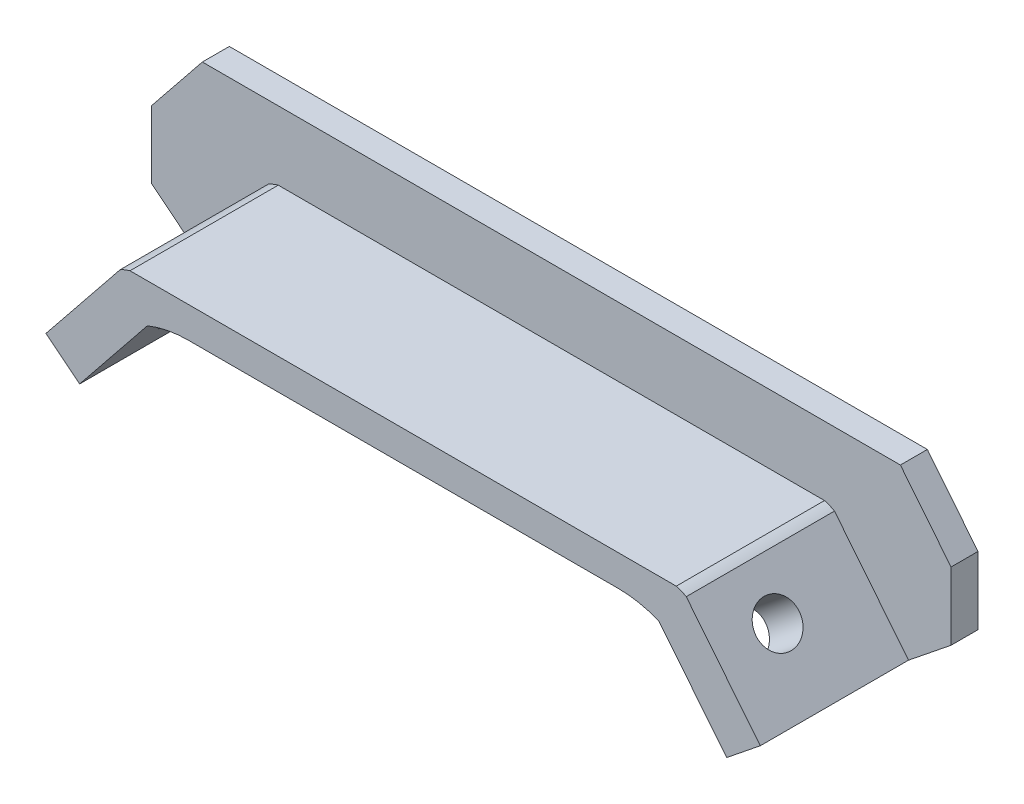
ISO-10303-21;
HEADER;
FILE_DESCRIPTION(('STEP AP214'),'2;1');
FILE_NAME('part.step','',(''),(''),'','','');
FILE_SCHEMA(('AUTOMOTIVE_DESIGN { 1 0 10303 214 1 1 1 1 }'));
ENDSEC;
DATA;
#1=APPLICATION_CONTEXT('core data for automotive mechanical design processes');
#2=APPLICATION_PROTOCOL_DEFINITION('international standard','automotive_design',2000,#1);
#3=PRODUCT_CONTEXT('',#1,'mechanical');
#4=PRODUCT('Part','Part','',(#3));
#5=PRODUCT_RELATED_PRODUCT_CATEGORY('part','',(#4));
#6=PRODUCT_DEFINITION_FORMATION('','',#4);
#7=PRODUCT_DEFINITION_CONTEXT('part definition',#1,'design');
#8=PRODUCT_DEFINITION('design','',#6,#7);
#9=PRODUCT_DEFINITION_SHAPE('','',#8);
#10=(LENGTH_UNIT() NAMED_UNIT(*) SI_UNIT(.MILLI.,.METRE.));
#11=(NAMED_UNIT(*) PLANE_ANGLE_UNIT() SI_UNIT($,.RADIAN.));
#12=(NAMED_UNIT(*) SI_UNIT($,.STERADIAN.) SOLID_ANGLE_UNIT());
#13=UNCERTAINTY_MEASURE_WITH_UNIT(LENGTH_MEASURE(1.E-05),#10,'distance_accuracy_value','');
#14=(GEOMETRIC_REPRESENTATION_CONTEXT(3) GLOBAL_UNCERTAINTY_ASSIGNED_CONTEXT((#13)) GLOBAL_UNIT_ASSIGNED_CONTEXT((#10,
#11,#12)) REPRESENTATION_CONTEXT('',''));
#15=CARTESIAN_POINT('',(0.,0.,0.));
#16=DIRECTION('',(0.,0.,1.));
#17=DIRECTION('',(1.,0.,0.));
#18=AXIS2_PLACEMENT_3D('',#15,#16,#17);
#19=CARTESIAN_POINT('',(-15.9530884003577,81.9,13.));
#20=DIRECTION('',(0.,0.,1.));
#21=DIRECTION('',(1.,0.,0.));
#22=AXIS2_PLACEMENT_3D('',#19,#20,#21);
#23=PLANE('',#22);
#24=DIRECTION('',(-0.779447316057059,-0.626467781686694,0.));
#25=VECTOR('',#24,1.);
#26=CARTESIAN_POINT('',(-32.1090383839074,39.9498657730275,13.));
#27=LINE('',#26,#25);
#28=CARTESIAN_POINT('',(26.5016886946061,87.05726022999,13.));
#29=VERTEX_POINT('',#28);
#30=CARTESIAN_POINT('',(24.0074572832235,85.0525633285926,13.));
#31=VERTEX_POINT('',#30);
#32=EDGE_CURVE('E469',#29,#31,#27,.T.);
#33=ORIENTED_EDGE('',*,*,#32,.F.);
#34=DIRECTION('',(-0.626467781686697,0.779447316057057,0.));
#35=VECTOR('',#34,1.);
#36=CARTESIAN_POINT('',(58.6107270785135,47.1073944569628,13.));
#37=LINE('',#36,#35);
#38=CARTESIAN_POINT('',(21.0070944191725,93.8936002398119,13.));
#39=VERTEX_POINT('',#38);
#40=EDGE_CURVE('E284',#29,#39,#37,.T.);
#41=ORIENTED_EDGE('',*,*,#40,.T.);
#42=CARTESIAN_POINT('',(19.4993683843613,91.3,13.));
#43=DIRECTION('',(0.,0.,1.));
#44=DIRECTION('',(1.,0.,0.));
#45=AXIS2_PLACEMENT_3D('',#42,#43,#44);
#46=CIRCLE('',#45,3.);
#47=CARTESIAN_POINT('',(20.2674829591482,94.2,13.));
#48=VERTEX_POINT('',#47);
#49=EDGE_CURVE('E462',#39,#48,#46,.T.);
#50=ORIENTED_EDGE('',*,*,#49,.T.);
#51=DIRECTION('',(1.,0.,0.));
#52=VECTOR('',#51,1.);
#53=CARTESIAN_POINT('',(0.,94.2,13.));
#54=LINE('',#53,#52);
#55=CARTESIAN_POINT('',(-20.2674829591482,94.2,13.));
#56=VERTEX_POINT('',#55);
#57=EDGE_CURVE('E271',#56,#48,#54,.T.);
#58=ORIENTED_EDGE('',*,*,#57,.F.);
#59=CARTESIAN_POINT('',(-19.4993683843613,91.3,13.));
#60=DIRECTION('',(0.,0.,1.));
#61=DIRECTION('',(1.,0.,0.));
#62=AXIS2_PLACEMENT_3D('',#59,#60,#61);
#63=CIRCLE('',#62,3.);
#64=CARTESIAN_POINT('',(-21.0070944191725,93.8936002398119,13.));
#65=VERTEX_POINT('',#64);
#66=EDGE_CURVE('E454',#56,#65,#63,.T.);
#67=ORIENTED_EDGE('',*,*,#66,.T.);
#68=DIRECTION('',(0.626467781686695,0.779447316057058,0.));
#69=VECTOR('',#68,1.);
#70=CARTESIAN_POINT('',(-58.6107270785135,47.1073944569625,13.));
#71=LINE('',#70,#69);
#72=CARTESIAN_POINT('',(-26.5016886946061,87.05726022999,13.));
#73=VERTEX_POINT('',#72);
#74=EDGE_CURVE('E297',#73,#65,#71,.T.);
#75=ORIENTED_EDGE('',*,*,#74,.F.);
#76=DIRECTION('',(-0.779447316057059,0.626467781686694,0.));
#77=VECTOR('',#76,1.);
#78=CARTESIAN_POINT('',(32.1090383839074,39.9498657730275,13.));
#79=LINE('',#78,#77);
#80=CARTESIAN_POINT('',(-24.0074572832235,85.0525633285926,13.));
#81=VERTEX_POINT('',#80);
#82=EDGE_CURVE('E451',#81,#73,#79,.T.);
#83=ORIENTED_EDGE('',*,*,#82,.F.);
#84=DIRECTION('',(0.626467781686694,0.779447316057059,0.));
#85=VECTOR('',#84,1.);
#86=CARTESIAN_POINT('',(-18.9829203273492,91.3040609461419,13.));
#87=LINE('',#86,#85);
#88=CARTESIAN_POINT('',(-18.9829203273492,91.3040609461419,13.));
#89=VERTEX_POINT('',#88);
#90=EDGE_CURVE('E374',#81,#89,#87,.T.);
#91=ORIENTED_EDGE('',*,*,#90,.T.);
#92=CARTESIAN_POINT('',(-15.9530884003578,83.9,13.));
#93=DIRECTION('',(0.,0.,1.));
#94=DIRECTION('',(1.,0.,0.));
#95=AXIS2_PLACEMENT_3D('',#92,#93,#94);
#96=CIRCLE('',#95,8.);
#97=CARTESIAN_POINT('',(-15.9530884003577,91.9,13.));
#98=VERTEX_POINT('',#97);
#99=EDGE_CURVE('E435',#89,#98,#96,.F.);
#100=ORIENTED_EDGE('',*,*,#99,.T.);
#101=DIRECTION('',(-1.,0.,0.));
#102=VECTOR('',#101,1.);
#103=CARTESIAN_POINT('',(0.,91.9,13.));
#104=LINE('',#103,#102);
#105=CARTESIAN_POINT('',(15.9530884003577,91.9,13.));
#106=VERTEX_POINT('',#105);
#107=EDGE_CURVE('E437',#106,#98,#104,.T.);
#108=ORIENTED_EDGE('',*,*,#107,.F.);
#109=CARTESIAN_POINT('',(15.9530884003577,83.9,13.));
#110=DIRECTION('',(0.,0.,1.));
#111=DIRECTION('',(1.,0.,0.));
#112=AXIS2_PLACEMENT_3D('',#109,#110,#111);
#113=CIRCLE('',#112,8.00000000000001);
#114=CARTESIAN_POINT('',(18.9829203273492,91.3040609461419,13.));
#115=VERTEX_POINT('',#114);
#116=EDGE_CURVE('E474',#106,#115,#113,.F.);
#117=ORIENTED_EDGE('',*,*,#116,.T.);
#118=DIRECTION('',(-0.626467781686694,0.779447316057059,0.));
#119=VECTOR('',#118,1.);
#120=CARTESIAN_POINT('',(18.9829203273492,91.3040609461419,13.));
#121=LINE('',#120,#119);
#122=EDGE_CURVE('E459',#31,#115,#121,.T.);
#123=ORIENTED_EDGE('',*,*,#122,.F.);
#124=EDGE_LOOP('',(#33,#41,#50,#58,#67,#75,#83,#91,#100,#108,#117,#123));
#125=FACE_BOUND('',#124,.T.);
#126=ADVANCED_FACE('F86',(#125),#23,.T.);
#127=CARTESIAN_POINT('',(12.9983265505396,82.7875424611701,8.5));
#128=DIRECTION('',(0.779447316057059,0.626467781686694,0.));
#129=DIRECTION('',(-0.626467781686694,0.779447316057059,0.));
#130=AXIS2_PLACEMENT_3D('',#127,#128,#129);
#131=CYLINDRICAL_SURFACE('',#130,1.59999999999999);
#132=CARTESIAN_POINT('',(20.7927997111102,89.052220278037,8.5));
#133=DIRECTION('',(0.779447316057059,0.626467781686694,0.));
#134=DIRECTION('',(-0.626467781686694,0.779447316057059,0.));
#135=AXIS2_PLACEMENT_3D('',#132,#133,#134);
#136=CIRCLE('',#135,1.59999999999999);
#137=CARTESIAN_POINT('',(19.7904512604115,90.2993359837283,8.5));
#138=VERTEX_POINT('',#137);
#139=EDGE_CURVE('E330',#138,#138,#136,.T.);
#140=ORIENTED_EDGE('',*,*,#139,.F.);
#141=EDGE_LOOP('',(#140));
#142=FACE_BOUND('',#141,.T.);
#143=CARTESIAN_POINT('',(23.2870311224927,91.0569171794344,8.5));
#144=DIRECTION('',(0.779447316057056,0.626467781686697,0.));
#145=DIRECTION('',(-0.626467781686697,0.779447316057057,0.));
#146=AXIS2_PLACEMENT_3D('',#143,#144,#145);
#147=CIRCLE('',#146,1.59999999999999);
#148=CARTESIAN_POINT('',(22.284682671794,92.3040328851257,8.5));
#149=VERTEX_POINT('',#148);
#150=EDGE_CURVE('E316',#149,#149,#147,.F.);
#151=ORIENTED_EDGE('',*,*,#150,.F.);
#152=EDGE_LOOP('',(#151));
#153=FACE_BOUND('',#152,.T.);
#154=ADVANCED_FACE('F346',(#142,#153),#131,.F.);
#155=CARTESIAN_POINT('',(19.4993683843613,91.3,30.));
#156=DIRECTION('',(0.,0.,-1.));
#157=DIRECTION('',(-1.,0.,0.));
#158=AXIS2_PLACEMENT_3D('',#155,#156,#157);
#159=CYLINDRICAL_SURFACE('',#158,3.);
#160=ORIENTED_EDGE('',*,*,#49,.F.);
#161=DIRECTION('',(0.,0.,1.));
#162=VECTOR('',#161,1.);
#163=CARTESIAN_POINT('',(21.0070944191725,93.8936002398119,-38.5350892684035));
#164=LINE('',#163,#162);
#165=CARTESIAN_POINT('',(21.0070944191725,93.8936002398119,2.));
#166=VERTEX_POINT('',#165);
#167=EDGE_CURVE('E291',#166,#39,#164,.T.);
#168=ORIENTED_EDGE('',*,*,#167,.F.);
#169=CARTESIAN_POINT('',(19.4993683843613,91.3,2.));
#170=DIRECTION('',(0.,0.,-1.));
#171=DIRECTION('',(-1.,0.,0.));
#172=AXIS2_PLACEMENT_3D('',#169,#170,#171);
#173=CIRCLE('',#172,3.);
#174=CARTESIAN_POINT('',(20.2674829591482,94.2,1.99999999999999));
#175=VERTEX_POINT('',#174);
#176=EDGE_CURVE('E94',#175,#166,#173,.T.);
#177=ORIENTED_EDGE('',*,*,#176,.F.);
#178=DIRECTION('',(0.,0.,1.));
#179=VECTOR('',#178,1.);
#180=CARTESIAN_POINT('',(20.2674829591482,94.2,-38.5350892684035));
#181=LINE('',#180,#179);
#182=EDGE_CURVE('E310',#175,#48,#181,.T.);
#183=ORIENTED_EDGE('',*,*,#182,.T.);
#184=EDGE_LOOP('',(#160,#168,#177,#183));
#185=FACE_BOUND('',#184,.T.);
#186=ADVANCED_FACE('F349',(#185),#159,.T.);
#187=CARTESIAN_POINT('',(15.9530884003577,83.9,30.));
#188=DIRECTION('',(0.,0.,-1.));
#189=DIRECTION('',(-1.,0.,0.));
#190=AXIS2_PLACEMENT_3D('',#187,#188,#189);
#191=CYLINDRICAL_SURFACE('',#190,8.00000000000001);
#192=DIRECTION('',(0.,0.,1.));
#193=VECTOR('',#192,1.);
#194=CARTESIAN_POINT('',(18.9829203273492,91.3040609461419,-8.99959118304353));
#195=LINE('',#194,#193);
#196=CARTESIAN_POINT('',(18.9829203273492,91.3040609461419,0.));
#197=VERTEX_POINT('',#196);
#198=CARTESIAN_POINT('',(18.9829203273492,91.3040609461419,6.52425957633453));
#199=VERTEX_POINT('',#198);
#200=EDGE_CURVE('E743',#197,#199,#195,.T.);
#201=ORIENTED_EDGE('',*,*,#200,.T.);
#202=CARTESIAN_POINT('',(18.9829203273492,91.3040609461419,6.52425957633448));
#203=CARTESIAN_POINT('',(18.9304824622193,91.3255204414665,6.59677626942681));
#204=CARTESIAN_POINT('',(18.8802626921741,91.3454195182159,6.67130299883624));
#205=CARTESIAN_POINT('',(18.7848305529556,91.3822354008013,6.82427534278623));
#206=CARTESIAN_POINT('',(18.7396219125264,91.3991499913689,6.90272381331852));
#207=CARTESIAN_POINT('',(18.6120410690805,91.4457425228498,7.14447144736317));
#208=CARTESIAN_POINT('',(18.5382740371133,91.471047770058,7.31341321191011));
#209=CARTESIAN_POINT('',(18.4489140469861,91.5007786518661,7.57531953540701));
#210=CARTESIAN_POINT('',(18.4226278983982,91.5093313368534,7.66432553677778));
#211=CARTESIAN_POINT('',(18.377842475526,91.5237212271929,7.8444780818513));
#212=CARTESIAN_POINT('',(18.359338978367,91.5295599053494,7.9356234363179));
#213=CARTESIAN_POINT('',(18.3306400970698,91.5385518244609,8.11900523835731));
#214=CARTESIAN_POINT('',(18.3204150694541,91.5417146489379,8.21123658229134));
#215=CARTESIAN_POINT('',(18.3084336770981,91.5454162034224,8.39629652023294));
#216=CARTESIAN_POINT('',(18.3066763661345,91.5459552266262,8.48912504634764));
#217=CARTESIAN_POINT('',(18.3114402152188,91.5444870075484,8.6656819317287));
#218=CARTESIAN_POINT('',(18.3171878664764,91.5427176921169,8.74943388550931));
#219=CARTESIAN_POINT('',(18.3355122644797,91.5370243303972,8.91612184776044));
#220=CARTESIAN_POINT('',(18.3480911456385,91.53309961065,8.99905759295694));
#221=CARTESIAN_POINT('',(18.3958013512534,91.5180264445983,9.24619341626945));
#222=CARTESIAN_POINT('',(18.4408949610027,91.5035817160734,9.40836172609614));
#223=CARTESIAN_POINT('',(18.5566756798341,91.4647309737533,9.73002760683961));
#224=CARTESIAN_POINT('',(18.6283954618737,91.439917095388,9.88909850149368));
#225=CARTESIAN_POINT('',(18.751050942377,91.3948840948494,10.117304524625));
#226=CARTESIAN_POINT('',(18.7943338198747,91.3786166625252,10.191483522907));
#227=CARTESIAN_POINT('',(18.8853880697491,91.3433864572823,10.336297785409));
#228=CARTESIAN_POINT('',(18.9331564762391,91.3244254611858,10.4069353445256));
#229=CARTESIAN_POINT('',(18.9829203273492,91.3040609461419,10.4757404236655));
#230=B_SPLINE_CURVE_WITH_KNOTS('',3,(#202,#203,#204,#205,#206,#207,#208,#209,#210,#211,#212,
#213,#214,#215,#216,#217,#218,#219,#220,#221,#222,#223,#224,#225,#226,#227,#228,#229),
.UNSPECIFIED.,.F.,.F.,(4,2,2,2,2,2,2,2,2,2,2,2,2,4),(0.,0.275918503369109,0.552040956603707,
1.10716449004467,1.386457492538,1.66559875424785,1.94373599261745,2.22184214987558,
2.47342621497676,2.72508893261438,3.22948180331019,3.75592483916513,4.01796238568412,
4.2798278737013),.UNSPECIFIED.);
#231=CARTESIAN_POINT('',(18.9829203273492,91.3040609461419,10.4757404236655));
#232=VERTEX_POINT('',#231);
#233=EDGE_CURVE('E321',#199,#232,#230,.T.);
#234=ORIENTED_EDGE('',*,*,#233,.T.);
#235=EDGE_CURVE('E746',#232,#115,#195,.T.);
#236=ORIENTED_EDGE('',*,*,#235,.T.);
#237=ORIENTED_EDGE('',*,*,#116,.F.);
#238=DIRECTION('',(0.,0.,-1.));
#239=VECTOR('',#238,1.);
#240=CARTESIAN_POINT('',(15.9530884003577,91.9,30.));
#241=LINE('',#240,#239);
#242=CARTESIAN_POINT('',(15.9530884003577,91.9,0.));
#243=VERTEX_POINT('',#242);
#244=EDGE_CURVE('E235',#106,#243,#241,.T.);
#245=ORIENTED_EDGE('',*,*,#244,.T.);
#246=CARTESIAN_POINT('',(15.9530884003577,83.9,0.));
#247=DIRECTION('',(0.,0.,1.));
#248=DIRECTION('',(1.,0.,0.));
#249=AXIS2_PLACEMENT_3D('',#246,#247,#248);
#250=CIRCLE('',#249,8.00000000000001);
#251=EDGE_CURVE('E444',#243,#197,#250,.F.);
#252=ORIENTED_EDGE('',*,*,#251,.T.);
#253=EDGE_LOOP('',(#201,#234,#236,#237,#245,#252));
#254=FACE_BOUND('',#253,.T.);
#255=ADVANCED_FACE('F333',(#254),#191,.F.);
#256=CARTESIAN_POINT('',(-15.9530884003578,83.9,30.));
#257=DIRECTION('',(0.,0.,-1.));
#258=DIRECTION('',(-1.,0.,0.));
#259=AXIS2_PLACEMENT_3D('',#256,#257,#258);
#260=CYLINDRICAL_SURFACE('',#259,8.);
#261=CARTESIAN_POINT('',(-18.9829203273491,91.3040609461419,6.52425957633452));
#262=CARTESIAN_POINT('',(-18.9304824622193,91.3255204414666,6.59677626942684));
#263=CARTESIAN_POINT('',(-18.8802626921741,91.3454195182159,6.67130299883628));
#264=CARTESIAN_POINT('',(-18.7848305529556,91.3822354008014,6.82427534278627));
#265=CARTESIAN_POINT('',(-18.7396219125264,91.3991499913689,6.90272381331856));
#266=CARTESIAN_POINT('',(-18.6120410690805,91.4457425228498,7.14447144736321));
#267=CARTESIAN_POINT('',(-18.5382740371133,91.471047770058,7.31341321191015));
#268=CARTESIAN_POINT('',(-18.4489140469861,91.5007786518661,7.57531953540705));
#269=CARTESIAN_POINT('',(-18.4226278983982,91.5093313368534,7.66432553677782));
#270=CARTESIAN_POINT('',(-18.377842475526,91.5237212271929,7.84447808185134));
#271=CARTESIAN_POINT('',(-18.359338978367,91.5295599053494,7.93562343631793));
#272=CARTESIAN_POINT('',(-18.3306400970698,91.5385518244609,8.11900523835735));
#273=CARTESIAN_POINT('',(-18.3204150694541,91.5417146489379,8.21123658229137));
#274=CARTESIAN_POINT('',(-18.3084336770981,91.5454162034224,8.39629652023297));
#275=CARTESIAN_POINT('',(-18.3066763661345,91.5459552266262,8.48912504634767));
#276=CARTESIAN_POINT('',(-18.3114402152188,91.5444870075484,8.66568193172874));
#277=CARTESIAN_POINT('',(-18.3171878664764,91.5427176921169,8.74943388550934));
#278=CARTESIAN_POINT('',(-18.3355122644797,91.5370243303971,8.91612184776047));
#279=CARTESIAN_POINT('',(-18.3480911456385,91.5330996106499,8.99905759295696));
#280=CARTESIAN_POINT('',(-18.3958013512534,91.5180264445983,9.24619341626948));
#281=CARTESIAN_POINT('',(-18.4408949610027,91.5035817160734,9.40836172609617));
#282=CARTESIAN_POINT('',(-18.5566756798341,91.4647309737533,9.73002760683963));
#283=CARTESIAN_POINT('',(-18.6283954618737,91.439917095388,9.88909850149369));
#284=CARTESIAN_POINT('',(-18.751050942377,91.3948840948494,10.117304524625));
#285=CARTESIAN_POINT('',(-18.7943338198747,91.3786166625252,10.191483522907));
#286=CARTESIAN_POINT('',(-18.8853880697491,91.3433864572823,10.336297785409));
#287=CARTESIAN_POINT('',(-18.9331564762391,91.3244254611858,10.4069353445256));
#288=CARTESIAN_POINT('',(-18.9829203273492,91.3040609461419,10.4757404236655));
#289=B_SPLINE_CURVE_WITH_KNOTS('',3,(#261,#262,#263,#264,#265,#266,#267,#268,#269,#270,#271,
#272,#273,#274,#275,#276,#277,#278,#279,#280,#281,#282,#283,#284,#285,#286,#287,#288),
.UNSPECIFIED.,.F.,.F.,(4,2,2,2,2,2,2,2,2,2,2,2,2,4),(0.,0.275918503369107,0.552040956603701,
1.10716449004466,1.386457492538,1.66559875424784,1.94373599261744,2.22184214987556,
2.47342621497674,2.72508893261436,3.22948180331017,3.75592483916508,4.01796238568406,
4.27982787370123),.UNSPECIFIED.);
#290=CARTESIAN_POINT('',(-18.9829203273492,91.3040609461419,6.52425957633453));
#291=VERTEX_POINT('',#290);
#292=CARTESIAN_POINT('',(-18.9829203273492,91.3040609461419,10.4757404236655));
#293=VERTEX_POINT('',#292);
#294=EDGE_CURVE('E362',#291,#293,#289,.T.);
#295=ORIENTED_EDGE('',*,*,#294,.F.);
#296=DIRECTION('',(0.,0.,1.));
#297=VECTOR('',#296,1.);
#298=CARTESIAN_POINT('',(-18.9829203273492,91.3040609461419,-8.99959118304353));
#299=LINE('',#298,#297);
#300=CARTESIAN_POINT('',(-18.9829203273492,91.3040609461419,0.));
#301=VERTEX_POINT('',#300);
#302=EDGE_CURVE('E477',#301,#291,#299,.T.);
#303=ORIENTED_EDGE('',*,*,#302,.F.);
#304=CARTESIAN_POINT('',(-15.9530884003578,83.9,0.));
#305=DIRECTION('',(0.,0.,1.));
#306=DIRECTION('',(1.,0.,0.));
#307=AXIS2_PLACEMENT_3D('',#304,#305,#306);
#308=CIRCLE('',#307,8.);
#309=CARTESIAN_POINT('',(-15.9530884003577,91.9,0.));
#310=VERTEX_POINT('',#309);
#311=EDGE_CURVE('E429',#301,#310,#308,.F.);
#312=ORIENTED_EDGE('',*,*,#311,.T.);
#313=DIRECTION('',(0.,0.,-1.));
#314=VECTOR('',#313,1.);
#315=CARTESIAN_POINT('',(-15.9530884003577,91.9,30.));
#316=LINE('',#315,#314);
#317=EDGE_CURVE('E448',#98,#310,#316,.T.);
#318=ORIENTED_EDGE('',*,*,#317,.F.);
#319=ORIENTED_EDGE('',*,*,#99,.F.);
#320=EDGE_CURVE('E496',#293,#89,#299,.T.);
#321=ORIENTED_EDGE('',*,*,#320,.F.);
#322=EDGE_LOOP('',(#295,#303,#312,#318,#319,#321));
#323=FACE_BOUND('',#322,.T.);
#324=ADVANCED_FACE('F376',(#323),#260,.F.);
#325=CARTESIAN_POINT('',(0.,91.9,30.));
#326=DIRECTION('',(0.,-1.,0.));
#327=DIRECTION('',(1.,0.,0.));
#328=AXIS2_PLACEMENT_3D('',#325,#326,#327);
#329=PLANE('',#328);
#330=ORIENTED_EDGE('',*,*,#244,.F.);
#331=ORIENTED_EDGE('',*,*,#107,.T.);
#332=ORIENTED_EDGE('',*,*,#317,.T.);
#333=DIRECTION('',(-1.,0.,0.));
#334=VECTOR('',#333,1.);
#335=CARTESIAN_POINT('',(0.,91.9,0.));
#336=LINE('',#335,#334);
#337=EDGE_CURVE('E441',#243,#310,#336,.T.);
#338=ORIENTED_EDGE('',*,*,#337,.F.);
#339=EDGE_LOOP('',(#330,#331,#332,#338));
#340=FACE_BOUND('',#339,.T.);
#341=ADVANCED_FACE('F379',(#340),#329,.T.);
#342=CARTESIAN_POINT('',(-32.1090383839074,39.9498657730275,30.));
#343=DIRECTION('',(0.626467781686694,-0.779447316057059,0.));
#344=DIRECTION('',(0.779447316057059,0.626467781686694,0.));
#345=AXIS2_PLACEMENT_3D('',#342,#343,#344);
#346=PLANE('',#345);
#347=DIRECTION('',(0.779447316057059,0.626467781686694,0.));
#348=VECTOR('',#347,1.);
#349=CARTESIAN_POINT('',(-32.1090383839074,39.9498657730275,2.));
#350=LINE('',#349,#348);
#351=CARTESIAN_POINT('',(26.5016886946061,87.05726022999,2.));
#352=VERTEX_POINT('',#351);
#353=CARTESIAN_POINT('',(29.6575781578175,89.5937537562847,2.));
#354=VERTEX_POINT('',#353);
#355=EDGE_CURVE('E289',#352,#354,#350,.T.);
#356=ORIENTED_EDGE('',*,*,#355,.F.);
#357=DIRECTION('',(0.,0.,1.));
#358=VECTOR('',#357,1.);
#359=CARTESIAN_POINT('',(26.5016886946061,87.05726022999,-38.5350892684035));
#360=LINE('',#359,#358);
#361=EDGE_CURVE('E288',#352,#29,#360,.T.);
#362=ORIENTED_EDGE('',*,*,#361,.T.);
#363=ORIENTED_EDGE('',*,*,#32,.T.);
#364=DIRECTION('',(0.,0.,1.));
#365=VECTOR('',#364,1.);
#366=CARTESIAN_POINT('',(24.0074572832235,85.0525633285926,-8.99959118304353));
#367=LINE('',#366,#365);
#368=CARTESIAN_POINT('',(24.0074572832235,85.0525633285926,0.));
#369=VERTEX_POINT('',#368);
#370=EDGE_CURVE('E740',#369,#31,#367,.T.);
#371=ORIENTED_EDGE('',*,*,#370,.F.);
#372=DIRECTION('',(-0.779447316057059,-0.626467781686694,0.));
#373=VECTOR('',#372,1.);
#374=CARTESIAN_POINT('',(-32.1090383839074,39.9498657730275,0.));
#375=LINE('',#374,#373);
#376=CARTESIAN_POINT('',(29.6575781578175,89.5937537562847,0.));
#377=VERTEX_POINT('',#376);
#378=EDGE_CURVE('E236',#377,#369,#375,.T.);
#379=ORIENTED_EDGE('',*,*,#378,.F.);
#380=DIRECTION('',(0.,0.,1.));
#381=VECTOR('',#380,1.);
#382=CARTESIAN_POINT('',(29.6575781578175,89.5937537562847,-10.0953213547641));
#383=LINE('',#382,#381);
#384=EDGE_CURVE('E259',#377,#354,#383,.T.);
#385=ORIENTED_EDGE('',*,*,#384,.T.);
#386=EDGE_LOOP('',(#356,#362,#363,#371,#379,#385));
#387=FACE_BOUND('',#386,.T.);
#388=ADVANCED_FACE('F407',(#387),#346,.T.);
#389=CARTESIAN_POINT('',(32.1090383839074,39.9498657730275,30.));
#390=DIRECTION('',(-0.626467781686694,-0.779447316057059,0.));
#391=DIRECTION('',(0.779447316057059,-0.626467781686694,0.));
#392=AXIS2_PLACEMENT_3D('',#389,#390,#391);
#393=PLANE('',#392);
#394=DIRECTION('',(0.779447316057059,-0.626467781686694,0.));
#395=VECTOR('',#394,1.);
#396=CARTESIAN_POINT('',(32.1090383839074,39.9498657730275,2.));
#397=LINE('',#396,#395);
#398=CARTESIAN_POINT('',(-29.6575781578175,89.5937537562846,2.));
#399=VERTEX_POINT('',#398);
#400=CARTESIAN_POINT('',(-26.501688694606,87.05726022999,2.));
#401=VERTEX_POINT('',#400);
#402=EDGE_CURVE('E243',#399,#401,#397,.T.);
#403=ORIENTED_EDGE('',*,*,#402,.F.);
#404=DIRECTION('',(0.,0.,1.));
#405=VECTOR('',#404,1.);
#406=CARTESIAN_POINT('',(-29.6575781578175,89.5937537562846,-10.0953213547641));
#407=LINE('',#406,#405);
#408=CARTESIAN_POINT('',(-29.6575781578175,89.5937537562846,0.));
#409=VERTEX_POINT('',#408);
#410=EDGE_CURVE('E239',#409,#399,#407,.T.);
#411=ORIENTED_EDGE('',*,*,#410,.F.);
#412=DIRECTION('',(-0.779447316057059,0.626467781686694,0.));
#413=VECTOR('',#412,1.);
#414=CARTESIAN_POINT('',(32.1090383839074,39.9498657730275,0.));
#415=LINE('',#414,#413);
#416=CARTESIAN_POINT('',(-24.0074572832235,85.0525633285926,0.));
#417=VERTEX_POINT('',#416);
#418=EDGE_CURVE('E222',#417,#409,#415,.T.);
#419=ORIENTED_EDGE('',*,*,#418,.F.);
#420=DIRECTION('',(0.,0.,1.));
#421=VECTOR('',#420,1.);
#422=CARTESIAN_POINT('',(-24.0074572832235,85.0525633285926,-8.99959118304353));
#423=LINE('',#422,#421);
#424=EDGE_CURVE('E495',#417,#81,#423,.T.);
#425=ORIENTED_EDGE('',*,*,#424,.T.);
#426=ORIENTED_EDGE('',*,*,#82,.T.);
#427=DIRECTION('',(0.,0.,1.));
#428=VECTOR('',#427,1.);
#429=CARTESIAN_POINT('',(-26.5016886946061,87.05726022999,-38.5350892684035));
#430=LINE('',#429,#428);
#431=EDGE_CURVE('E293',#401,#73,#430,.T.);
#432=ORIENTED_EDGE('',*,*,#431,.F.);
#433=EDGE_LOOP('',(#403,#411,#419,#425,#426,#432));
#434=FACE_BOUND('',#433,.T.);
#435=ADVANCED_FACE('F240',(#434),#393,.T.);
#436=CARTESIAN_POINT('',(0.,0.,0.));
#437=DIRECTION('',(0.,0.,1.));
#438=DIRECTION('',(1.,0.,0.));
#439=AXIS2_PLACEMENT_3D('',#436,#437,#438);
#440=PLANE('',#439);
#441=DIRECTION('',(-0.626467781686695,-0.779447316057058,0.));
#442=VECTOR('',#441,1.);
#443=CARTESIAN_POINT('',(-64.2227477541243,51.6179624851068,0.));
#444=LINE('',#443,#442);
#445=CARTESIAN_POINT('',(-25.899105279653,99.3,0.));
#446=VERTEX_POINT('',#445);
#447=CARTESIAN_POINT('',(-29.6575781578175,94.6237314304159,0.));
#448=VERTEX_POINT('',#447);
#449=EDGE_CURVE('E260',#446,#448,#444,.T.);
#450=ORIENTED_EDGE('',*,*,#449,.F.);
#451=DIRECTION('',(1.,0.,0.));
#452=VECTOR('',#451,1.);
#453=CARTESIAN_POINT('',(0.,99.3,0.));
#454=LINE('',#453,#452);
#455=CARTESIAN_POINT('',(25.899105279653,99.3,0.));
#456=VERTEX_POINT('',#455);
#457=EDGE_CURVE('E430',#446,#456,#454,.T.);
#458=ORIENTED_EDGE('',*,*,#457,.T.);
#459=DIRECTION('',(0.626467781686694,-0.779447316057059,0.));
#460=VECTOR('',#459,1.);
#461=CARTESIAN_POINT('',(64.2227477541243,51.6179624851066,0.));
#462=LINE('',#461,#460);
#463=CARTESIAN_POINT('',(29.6575781578175,94.6237314304159,0.));
#464=VERTEX_POINT('',#463);
#465=EDGE_CURVE('E268',#456,#464,#462,.T.);
#466=ORIENTED_EDGE('',*,*,#465,.T.);
#467=DIRECTION('',(0.,-1.,0.));
#468=VECTOR('',#467,1.);
#469=CARTESIAN_POINT('',(29.6575781578175,0.,0.));
#470=LINE('',#469,#468);
#471=EDGE_CURVE('E265',#464,#377,#470,.T.);
#472=ORIENTED_EDGE('',*,*,#471,.T.);
#473=ORIENTED_EDGE('',*,*,#378,.T.);
#474=DIRECTION('',(0.626467781686694,-0.779447316057059,0.));
#475=VECTOR('',#474,1.);
#476=CARTESIAN_POINT('',(18.9829203273492,91.3040609461419,0.));
#477=LINE('',#476,#475);
#478=EDGE_CURVE('E331',#197,#369,#477,.T.);
#479=ORIENTED_EDGE('',*,*,#478,.F.);
#480=ORIENTED_EDGE('',*,*,#251,.F.);
#481=ORIENTED_EDGE('',*,*,#337,.T.);
#482=ORIENTED_EDGE('',*,*,#311,.F.);
#483=DIRECTION('',(-0.626467781686694,-0.779447316057059,0.));
#484=VECTOR('',#483,1.);
#485=CARTESIAN_POINT('',(-18.9829203273492,91.3040609461419,0.));
#486=LINE('',#485,#484);
#487=EDGE_CURVE('E231',#301,#417,#486,.T.);
#488=ORIENTED_EDGE('',*,*,#487,.T.);
#489=ORIENTED_EDGE('',*,*,#418,.T.);
#490=DIRECTION('',(0.,-1.,0.));
#491=VECTOR('',#490,1.);
#492=CARTESIAN_POINT('',(-29.6575781578175,89.5937537562846,0.));
#493=LINE('',#492,#491);
#494=EDGE_CURVE('E227',#448,#409,#493,.T.);
#495=ORIENTED_EDGE('',*,*,#494,.F.);
#496=EDGE_LOOP('',(#450,#458,#466,#472,#473,#479,#480,#481,#482,#488,#489,#495));
#497=FACE_BOUND('',#496,.T.);
#498=ADVANCED_FACE('F225',(#497),#440,.F.);
#499=CARTESIAN_POINT('',(0.,99.3,2.));
#500=DIRECTION('',(0.,1.,0.));
#501=DIRECTION('',(0.,0.,1.));
#502=AXIS2_PLACEMENT_3D('',#499,#500,#501);
#503=PLANE('',#502);
#504=ORIENTED_EDGE('',*,*,#457,.F.);
#505=DIRECTION('',(0.,0.,1.));
#506=VECTOR('',#505,1.);
#507=CARTESIAN_POINT('',(-25.899105279653,99.3,-10.0953213547641));
#508=LINE('',#507,#506);
#509=CARTESIAN_POINT('',(-25.899105279653,99.3,2.));
#510=VERTEX_POINT('',#509);
#511=EDGE_CURVE('E255',#446,#510,#508,.T.);
#512=ORIENTED_EDGE('',*,*,#511,.T.);
#513=DIRECTION('',(1.,0.,0.));
#514=VECTOR('',#513,1.);
#515=CARTESIAN_POINT('',(0.,99.3,2.));
#516=LINE('',#515,#514);
#517=CARTESIAN_POINT('',(25.899105279653,99.3,2.));
#518=VERTEX_POINT('',#517);
#519=EDGE_CURVE('E428',#510,#518,#516,.T.);
#520=ORIENTED_EDGE('',*,*,#519,.T.);
#521=DIRECTION('',(0.,0.,1.));
#522=VECTOR('',#521,1.);
#523=CARTESIAN_POINT('',(25.899105279653,99.3,-10.0953213547641));
#524=LINE('',#523,#522);
#525=EDGE_CURVE('E278',#456,#518,#524,.T.);
#526=ORIENTED_EDGE('',*,*,#525,.F.);
#527=EDGE_LOOP('',(#504,#512,#520,#526));
#528=FACE_BOUND('',#527,.T.);
#529=ADVANCED_FACE('F399',(#528),#503,.T.);
#530=CARTESIAN_POINT('',(0.,0.,2.));
#531=DIRECTION('',(0.,0.,-1.));
#532=DIRECTION('',(-1.,0.,0.));
#533=AXIS2_PLACEMENT_3D('',#530,#531,#532);
#534=PLANE('',#533);
#535=ORIENTED_EDGE('',*,*,#519,.F.);
#536=DIRECTION('',(0.626467781686695,0.779447316057058,0.));
#537=VECTOR('',#536,1.);
#538=CARTESIAN_POINT('',(-64.2227477541243,51.6179624851068,2.));
#539=LINE('',#538,#537);
#540=CARTESIAN_POINT('',(-29.6575781578175,94.6237314304159,2.));
#541=VERTEX_POINT('',#540);
#542=EDGE_CURVE('E252',#541,#510,#539,.T.);
#543=ORIENTED_EDGE('',*,*,#542,.F.);
#544=DIRECTION('',(0.,1.,0.));
#545=VECTOR('',#544,1.);
#546=CARTESIAN_POINT('',(-29.6575781578175,89.5937537562846,2.));
#547=LINE('',#546,#545);
#548=EDGE_CURVE('E246',#399,#541,#547,.T.);
#549=ORIENTED_EDGE('',*,*,#548,.F.);
#550=ORIENTED_EDGE('',*,*,#402,.T.);
#551=DIRECTION('',(0.626467781686695,0.779447316057059,0.));
#552=VECTOR('',#551,1.);
#553=CARTESIAN_POINT('',(-58.6107270785135,47.1073944569625,2.));
#554=LINE('',#553,#552);
#555=CARTESIAN_POINT('',(-21.0070944191725,93.8936002398119,1.99999999999999));
#556=VERTEX_POINT('',#555);
#557=EDGE_CURVE('E299',#401,#556,#554,.T.);
#558=ORIENTED_EDGE('',*,*,#557,.T.);
#559=CARTESIAN_POINT('',(-19.4993683843613,91.3,2.));
#560=DIRECTION('',(0.,0.,-1.));
#561=DIRECTION('',(-1.,0.,0.));
#562=AXIS2_PLACEMENT_3D('',#559,#560,#561);
#563=CIRCLE('',#562,3.);
#564=CARTESIAN_POINT('',(-20.2674829591482,94.2,2.));
#565=VERTEX_POINT('',#564);
#566=EDGE_CURVE('E12',#556,#565,#563,.T.);
#567=ORIENTED_EDGE('',*,*,#566,.T.);
#568=DIRECTION('',(1.,0.,0.));
#569=VECTOR('',#568,1.);
#570=CARTESIAN_POINT('',(0.,94.2,2.));
#571=LINE('',#570,#569);
#572=EDGE_CURVE('E109',#565,#175,#571,.T.);
#573=ORIENTED_EDGE('',*,*,#572,.T.);
#574=ORIENTED_EDGE('',*,*,#176,.T.);
#575=DIRECTION('',(-0.626467781686697,0.779447316057057,0.));
#576=VECTOR('',#575,1.);
#577=CARTESIAN_POINT('',(58.6107270785135,47.1073944569628,2.));
#578=LINE('',#577,#576);
#579=EDGE_CURVE('E101',#352,#166,#578,.T.);
#580=ORIENTED_EDGE('',*,*,#579,.F.);
#581=ORIENTED_EDGE('',*,*,#355,.T.);
#582=DIRECTION('',(0.,1.,0.));
#583=VECTOR('',#582,1.);
#584=CARTESIAN_POINT('',(29.6575781578175,0.,2.));
#585=LINE('',#584,#583);
#586=CARTESIAN_POINT('',(29.6575781578175,94.6237314304159,2.));
#587=VERTEX_POINT('',#586);
#588=EDGE_CURVE('E275',#354,#587,#585,.T.);
#589=ORIENTED_EDGE('',*,*,#588,.T.);
#590=DIRECTION('',(-0.626467781686694,0.779447316057059,0.));
#591=VECTOR('',#590,1.);
#592=CARTESIAN_POINT('',(64.2227477541243,51.6179624851066,2.));
#593=LINE('',#592,#591);
#594=EDGE_CURVE('E272',#587,#518,#593,.T.);
#595=ORIENTED_EDGE('',*,*,#594,.T.);
#596=EDGE_LOOP('',(#535,#543,#549,#550,#558,#567,#573,#574,#580,#581,#589,#595));
#597=FACE_BOUND('',#596,.T.);
#598=ADVANCED_FACE('F396',(#597),#534,.F.);
#599=CARTESIAN_POINT('',(-18.9829203273492,91.3040609461419,-8.99959118304353));
#600=DIRECTION('',(0.779447316057059,-0.626467781686694,0.));
#601=DIRECTION('',(0.626467781686694,0.779447316057059,0.));
#602=AXIS2_PLACEMENT_3D('',#599,#600,#601);
#603=PLANE('',#602);
#604=ORIENTED_EDGE('',*,*,#302,.T.);
#605=CARTESIAN_POINT('',(-20.7927997111102,89.052220278037,8.5));
#606=DIRECTION('',(0.779447316057059,-0.626467781686694,0.));
#607=DIRECTION('',(0.626467781686694,0.779447316057059,0.));
#608=AXIS2_PLACEMENT_3D('',#605,#606,#607);
#609=CIRCLE('',#608,3.5);
#610=EDGE_CURVE('E372',#291,#293,#609,.T.);
#611=ORIENTED_EDGE('',*,*,#610,.T.);
#612=ORIENTED_EDGE('',*,*,#320,.T.);
#613=ORIENTED_EDGE('',*,*,#90,.F.);
#614=ORIENTED_EDGE('',*,*,#424,.F.);
#615=ORIENTED_EDGE('',*,*,#487,.F.);
#616=EDGE_LOOP('',(#604,#611,#612,#613,#614,#615));
#617=FACE_BOUND('',#616,.T.);
#618=CARTESIAN_POINT('',(-20.7927997111102,89.052220278037,8.5));
#619=DIRECTION('',(0.779447316057059,-0.626467781686694,0.));
#620=DIRECTION('',(0.626467781686694,0.779447316057059,0.));
#621=AXIS2_PLACEMENT_3D('',#618,#619,#620);
#622=CIRCLE('',#621,1.59999999999999);
#623=CARTESIAN_POINT('',(-19.7904512604115,90.2993359837283,8.5));
#624=VERTEX_POINT('',#623);
#625=EDGE_CURVE('E371',#624,#624,#622,.F.);
#626=ORIENTED_EDGE('',*,*,#625,.T.);
#627=EDGE_LOOP('',(#626));
#628=FACE_BOUND('',#627,.T.);
#629=ADVANCED_FACE('F395',(#617,#628),#603,.T.);
#630=CARTESIAN_POINT('',(-12.9983265505396,82.7875424611701,8.5));
#631=DIRECTION('',(-0.779447316057059,0.626467781686694,0.));
#632=DIRECTION('',(-0.626467781686694,-0.779447316057059,0.));
#633=AXIS2_PLACEMENT_3D('',#630,#631,#632);
#634=CYLINDRICAL_SURFACE('',#633,1.59999999999999);
#635=CARTESIAN_POINT('',(-23.2870311224927,91.0569171794344,8.5));
#636=DIRECTION('',(0.779447316057058,-0.626467781686694,0.));
#637=DIRECTION('',(0.626467781686695,0.779447316057059,0.));
#638=AXIS2_PLACEMENT_3D('',#635,#636,#637);
#639=CIRCLE('',#638,1.59999999999999);
#640=CARTESIAN_POINT('',(-22.284682671794,92.3040328851257,8.5));
#641=VERTEX_POINT('',#640);
#642=EDGE_CURVE('E287',#641,#641,#639,.T.);
#643=ORIENTED_EDGE('',*,*,#642,.F.);
#644=EDGE_LOOP('',(#643));
#645=FACE_BOUND('',#644,.T.);
#646=ORIENTED_EDGE('',*,*,#625,.F.);
#647=EDGE_LOOP('',(#646));
#648=FACE_BOUND('',#647,.T.);
#649=ADVANCED_FACE('F358',(#645,#648),#634,.F.);
#650=CARTESIAN_POINT('',(-12.9983265505396,82.7875424611701,8.5));
#651=DIRECTION('',(-0.779447316057059,0.626467781686694,0.));
#652=DIRECTION('',(-0.626467781686694,-0.779447316057059,0.));
#653=AXIS2_PLACEMENT_3D('',#650,#651,#652);
#654=CYLINDRICAL_SURFACE('',#653,3.5);
#655=ORIENTED_EDGE('',*,*,#294,.T.);
#656=ORIENTED_EDGE('',*,*,#610,.F.);
#657=EDGE_LOOP('',(#655,#656));
#658=FACE_BOUND('',#657,.T.);
#659=ADVANCED_FACE('F353',(#658),#654,.F.);
#660=CARTESIAN_POINT('',(18.9829203273492,91.3040609461419,-8.99959118304353));
#661=DIRECTION('',(0.779447316057059,0.626467781686694,0.));
#662=DIRECTION('',(-0.626467781686694,0.779447316057059,0.));
#663=AXIS2_PLACEMENT_3D('',#660,#661,#662);
#664=PLANE('',#663);
#665=ORIENTED_EDGE('',*,*,#235,.F.);
#666=CARTESIAN_POINT('',(20.7927997111102,89.052220278037,8.5));
#667=DIRECTION('',(0.779447316057059,0.626467781686694,0.));
#668=DIRECTION('',(-0.626467781686694,0.779447316057059,0.));
#669=AXIS2_PLACEMENT_3D('',#666,#667,#668);
#670=CIRCLE('',#669,3.5);
#671=EDGE_CURVE('E319',#199,#232,#670,.T.);
#672=ORIENTED_EDGE('',*,*,#671,.F.);
#673=ORIENTED_EDGE('',*,*,#200,.F.);
#674=ORIENTED_EDGE('',*,*,#478,.T.);
#675=ORIENTED_EDGE('',*,*,#370,.T.);
#676=ORIENTED_EDGE('',*,*,#122,.T.);
#677=EDGE_LOOP('',(#665,#672,#673,#674,#675,#676));
#678=FACE_BOUND('',#677,.T.);
#679=ORIENTED_EDGE('',*,*,#139,.T.);
#680=EDGE_LOOP('',(#679));
#681=FACE_BOUND('',#680,.T.);
#682=ADVANCED_FACE('F342',(#678,#681),#664,.F.);
#683=CARTESIAN_POINT('',(12.9983265505396,82.7875424611701,8.5));
#684=DIRECTION('',(0.779447316057059,0.626467781686694,0.));
#685=DIRECTION('',(-0.626467781686694,0.779447316057059,0.));
#686=AXIS2_PLACEMENT_3D('',#683,#684,#685);
#687=CYLINDRICAL_SURFACE('',#686,3.5);
#688=ORIENTED_EDGE('',*,*,#671,.T.);
#689=ORIENTED_EDGE('',*,*,#233,.F.);
#690=EDGE_LOOP('',(#688,#689));
#691=FACE_BOUND('',#690,.T.);
#692=ADVANCED_FACE('F337',(#691),#687,.F.);
#693=CARTESIAN_POINT('',(-19.4993683843613,91.3,30.));
#694=DIRECTION('',(0.,0.,-1.));
#695=DIRECTION('',(-1.,0.,0.));
#696=AXIS2_PLACEMENT_3D('',#693,#694,#695);
#697=CYLINDRICAL_SURFACE('',#696,3.);
#698=DIRECTION('',(0.,0.,1.));
#699=VECTOR('',#698,1.);
#700=CARTESIAN_POINT('',(-21.0070944191725,93.8936002398119,-38.5350892684035));
#701=LINE('',#700,#699);
#702=EDGE_CURVE('E303',#556,#65,#701,.T.);
#703=ORIENTED_EDGE('',*,*,#702,.T.);
#704=ORIENTED_EDGE('',*,*,#66,.F.);
#705=DIRECTION('',(0.,0.,1.));
#706=VECTOR('',#705,1.);
#707=CARTESIAN_POINT('',(-20.2674829591482,94.2,-38.5350892684035));
#708=LINE('',#707,#706);
#709=EDGE_CURVE('E300',#565,#56,#708,.T.);
#710=ORIENTED_EDGE('',*,*,#709,.F.);
#711=ORIENTED_EDGE('',*,*,#566,.F.);
#712=EDGE_LOOP('',(#703,#704,#710,#711));
#713=FACE_BOUND('',#712,.T.);
#714=ADVANCED_FACE('F88',(#713),#697,.T.);
#715=CARTESIAN_POINT('',(0.,94.2,-38.5350892684035));
#716=DIRECTION('',(0.,-1.,0.));
#717=DIRECTION('',(0.,0.,-1.));
#718=AXIS2_PLACEMENT_3D('',#715,#716,#717);
#719=PLANE('',#718);
#720=ORIENTED_EDGE('',*,*,#709,.T.);
#721=ORIENTED_EDGE('',*,*,#57,.T.);
#722=ORIENTED_EDGE('',*,*,#182,.F.);
#723=ORIENTED_EDGE('',*,*,#572,.F.);
#724=EDGE_LOOP('',(#720,#721,#722,#723));
#725=FACE_BOUND('',#724,.T.);
#726=ADVANCED_FACE('F344',(#725),#719,.F.);
#727=CARTESIAN_POINT('',(-58.6107270785135,47.1073944569625,-38.5350892684035));
#728=DIRECTION('',(0.779447316057058,-0.626467781686694,0.));
#729=DIRECTION('',(0.626467781686695,0.779447316057059,0.));
#730=AXIS2_PLACEMENT_3D('',#727,#728,#729);
#731=PLANE('',#730);
#732=ORIENTED_EDGE('',*,*,#642,.T.);
#733=EDGE_LOOP('',(#732));
#734=FACE_BOUND('',#733,.T.);
#735=ORIENTED_EDGE('',*,*,#431,.T.);
#736=ORIENTED_EDGE('',*,*,#74,.T.);
#737=ORIENTED_EDGE('',*,*,#702,.F.);
#738=ORIENTED_EDGE('',*,*,#557,.F.);
#739=EDGE_LOOP('',(#735,#736,#737,#738));
#740=FACE_BOUND('',#739,.T.);
#741=ADVANCED_FACE('F499',(#734,#740),#731,.F.);
#742=CARTESIAN_POINT('',(58.6107270785135,47.1073944569628,-38.5350892684035));
#743=DIRECTION('',(0.779447316057056,0.626467781686697,0.));
#744=DIRECTION('',(-0.626467781686697,0.779447316057057,0.));
#745=AXIS2_PLACEMENT_3D('',#742,#743,#744);
#746=PLANE('',#745);
#747=ORIENTED_EDGE('',*,*,#579,.T.);
#748=ORIENTED_EDGE('',*,*,#167,.T.);
#749=ORIENTED_EDGE('',*,*,#40,.F.);
#750=ORIENTED_EDGE('',*,*,#361,.F.);
#751=EDGE_LOOP('',(#747,#748,#749,#750));
#752=FACE_BOUND('',#751,.T.);
#753=ORIENTED_EDGE('',*,*,#150,.T.);
#754=EDGE_LOOP('',(#753));
#755=FACE_BOUND('',#754,.T.);
#756=ADVANCED_FACE('F465',(#752,#755),#746,.T.);
#757=CARTESIAN_POINT('',(64.2227477541243,51.6179624851066,-10.0953213547641));
#758=DIRECTION('',(0.779447316057059,0.626467781686694,0.));
#759=DIRECTION('',(-0.626467781686694,0.779447316057059,0.));
#760=AXIS2_PLACEMENT_3D('',#757,#758,#759);
#761=PLANE('',#760);
#762=ORIENTED_EDGE('',*,*,#465,.F.);
#763=ORIENTED_EDGE('',*,*,#525,.T.);
#764=ORIENTED_EDGE('',*,*,#594,.F.);
#765=DIRECTION('',(0.,0.,1.));
#766=VECTOR('',#765,1.);
#767=CARTESIAN_POINT('',(29.6575781578175,94.6237314304159,-10.0953213547641));
#768=LINE('',#767,#766);
#769=EDGE_CURVE('E269',#464,#587,#768,.T.);
#770=ORIENTED_EDGE('',*,*,#769,.F.);
#771=EDGE_LOOP('',(#762,#763,#764,#770));
#772=FACE_BOUND('',#771,.T.);
#773=ADVANCED_FACE('F425',(#772),#761,.T.);
#774=CARTESIAN_POINT('',(29.6575781578175,0.,-10.0953213547641));
#775=DIRECTION('',(1.,0.,0.));
#776=DIRECTION('',(0.,0.,-1.));
#777=AXIS2_PLACEMENT_3D('',#774,#775,#776);
#778=PLANE('',#777);
#779=ORIENTED_EDGE('',*,*,#471,.F.);
#780=ORIENTED_EDGE('',*,*,#769,.T.);
#781=ORIENTED_EDGE('',*,*,#588,.F.);
#782=ORIENTED_EDGE('',*,*,#384,.F.);
#783=EDGE_LOOP('',(#779,#780,#781,#782));
#784=FACE_BOUND('',#783,.T.);
#785=ADVANCED_FACE('F420',(#784),#778,.T.);
#786=CARTESIAN_POINT('',(-64.2227477541243,51.6179624851068,-10.0953213547641));
#787=DIRECTION('',(0.779447316057058,-0.626467781686695,0.));
#788=DIRECTION('',(0.626467781686695,0.779447316057058,0.));
#789=AXIS2_PLACEMENT_3D('',#786,#787,#788);
#790=PLANE('',#789);
#791=ORIENTED_EDGE('',*,*,#511,.F.);
#792=ORIENTED_EDGE('',*,*,#449,.T.);
#793=DIRECTION('',(0.,0.,1.));
#794=VECTOR('',#793,1.);
#795=CARTESIAN_POINT('',(-29.6575781578175,94.6237314304159,-10.0953213547641));
#796=LINE('',#795,#794);
#797=EDGE_CURVE('E250',#448,#541,#796,.T.);
#798=ORIENTED_EDGE('',*,*,#797,.T.);
#799=ORIENTED_EDGE('',*,*,#542,.T.);
#800=EDGE_LOOP('',(#791,#792,#798,#799));
#801=FACE_BOUND('',#800,.T.);
#802=ADVANCED_FACE('F434',(#801),#790,.F.);
#803=CARTESIAN_POINT('',(-29.6575781578175,0.,-10.0953213547641));
#804=DIRECTION('',(1.,0.,0.));
#805=DIRECTION('',(0.,0.,-1.));
#806=AXIS2_PLACEMENT_3D('',#803,#804,#805);
#807=PLANE('',#806);
#808=ORIENTED_EDGE('',*,*,#797,.F.);
#809=ORIENTED_EDGE('',*,*,#494,.T.);
#810=ORIENTED_EDGE('',*,*,#410,.T.);
#811=ORIENTED_EDGE('',*,*,#548,.T.);
#812=EDGE_LOOP('',(#808,#809,#810,#811));
#813=FACE_BOUND('',#812,.T.);
#814=ADVANCED_FACE('F248',(#813),#807,.F.);
#815=CLOSED_SHELL('',(#126,#154,#186,#255,#324,#341,#388,#435,#498,#529,#598,#629,#649,#659,
#682,#692,#714,#726,#741,#756,#773,#785,#802,#814));
#816=MANIFOLD_SOLID_BREP('B2',#815);
#817=ADVANCED_BREP_SHAPE_REPRESENTATION('',(#18,#816),#14);
#818=SHAPE_DEFINITION_REPRESENTATION(#9,#817);
ENDSEC;
END-ISO-10303-21;
